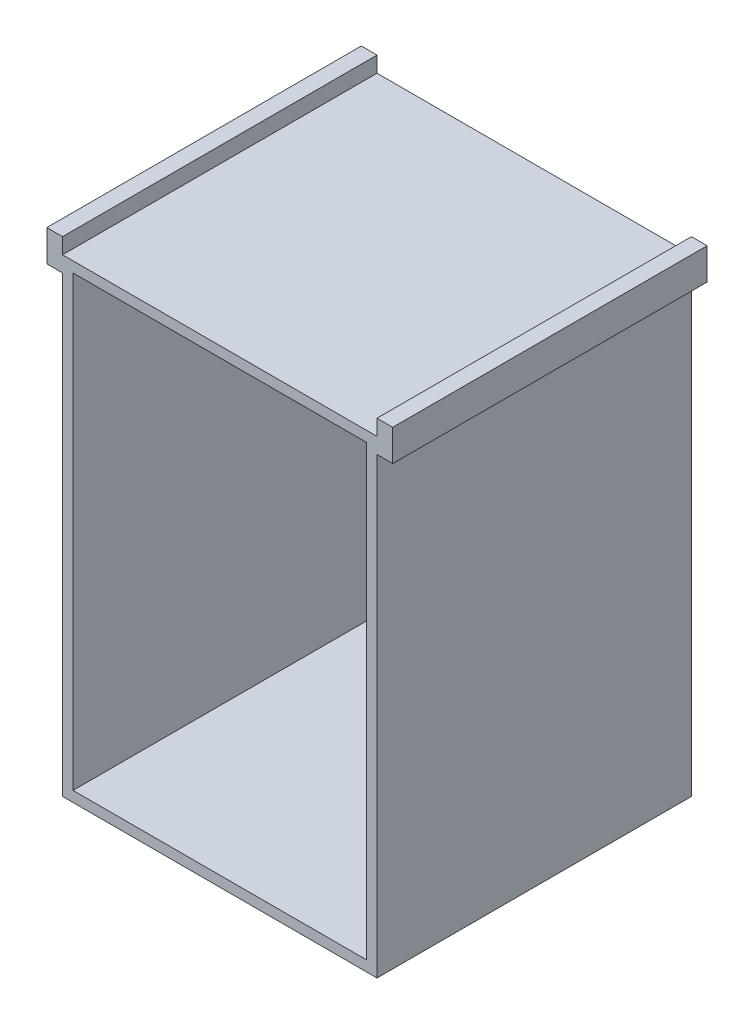
ISO-10303-21;
HEADER;
FILE_DESCRIPTION(('STEP AP214'),'2;1');
FILE_NAME('part.step','',(''),(''),'','','');
FILE_SCHEMA(('AUTOMOTIVE_DESIGN { 1 0 10303 214 1 1 1 1 }'));
ENDSEC;
DATA;
#1=APPLICATION_CONTEXT('core data for automotive mechanical design processes');
#2=APPLICATION_PROTOCOL_DEFINITION('international standard','automotive_design',2000,#1);
#3=PRODUCT_CONTEXT('',#1,'mechanical');
#4=PRODUCT('Part','Part','',(#3));
#5=PRODUCT_RELATED_PRODUCT_CATEGORY('part','',(#4));
#6=PRODUCT_DEFINITION_FORMATION('','',#4);
#7=PRODUCT_DEFINITION_CONTEXT('part definition',#1,'design');
#8=PRODUCT_DEFINITION('design','',#6,#7);
#9=PRODUCT_DEFINITION_SHAPE('','',#8);
#10=(LENGTH_UNIT() NAMED_UNIT(*) SI_UNIT(.MILLI.,.METRE.));
#11=(NAMED_UNIT(*) PLANE_ANGLE_UNIT() SI_UNIT($,.RADIAN.));
#12=(NAMED_UNIT(*) SI_UNIT($,.STERADIAN.) SOLID_ANGLE_UNIT());
#13=UNCERTAINTY_MEASURE_WITH_UNIT(LENGTH_MEASURE(1.E-05),#10,'distance_accuracy_value','');
#14=(GEOMETRIC_REPRESENTATION_CONTEXT(3) GLOBAL_UNCERTAINTY_ASSIGNED_CONTEXT((#13)) GLOBAL_UNIT_ASSIGNED_CONTEXT((#10,
#11,#12)) REPRESENTATION_CONTEXT('',''));
#15=CARTESIAN_POINT('',(0.,0.,0.));
#16=DIRECTION('',(0.,0.,1.));
#17=DIRECTION('',(1.,0.,0.));
#18=AXIS2_PLACEMENT_3D('',#15,#16,#17);
#19=CARTESIAN_POINT('',(-100.647761504265,89.5,5.40836964344638));
#20=DIRECTION('',(1.,0.,0.));
#21=DIRECTION('',(0.,0.,-1.));
#22=AXIS2_PLACEMENT_3D('',#19,#20,#21);
#23=PLANE('',#22);
#24=DIRECTION('',(0.,-1.,0.));
#25=VECTOR('',#24,1.);
#26=CARTESIAN_POINT('',(-100.647761504265,89.5,5.40836964344638));
#27=LINE('',#26,#25);
#28=CARTESIAN_POINT('',(-100.647761504265,86.5,5.40836964344638));
#29=VERTEX_POINT('',#28);
#30=CARTESIAN_POINT('',(-100.647761504265,0.,5.40836964344638));
#31=VERTEX_POINT('',#30);
#32=EDGE_CURVE('E11',#29,#31,#27,.T.);
#33=ORIENTED_EDGE('',*,*,#32,.F.);
#34=DIRECTION('',(0.,0.,-1.));
#35=VECTOR('',#34,1.);
#36=CARTESIAN_POINT('',(-100.647761504265,86.5,5.40836964344638));
#37=LINE('',#36,#35);
#38=CARTESIAN_POINT('',(-100.647761504265,86.5,-54.5916303565536));
#39=VERTEX_POINT('',#38);
#40=EDGE_CURVE('E224',#29,#39,#37,.T.);
#41=ORIENTED_EDGE('',*,*,#40,.T.);
#42=DIRECTION('',(0.,-1.,0.));
#43=VECTOR('',#42,1.);
#44=CARTESIAN_POINT('',(-100.647761504265,89.5,-54.5916303565536));
#45=LINE('',#44,#43);
#46=CARTESIAN_POINT('',(-100.647761504265,0.,-54.5916303565536));
#47=VERTEX_POINT('',#46);
#48=EDGE_CURVE('E308',#39,#47,#45,.T.);
#49=ORIENTED_EDGE('',*,*,#48,.T.);
#50=DIRECTION('',(0.,0.,1.));
#51=VECTOR('',#50,1.);
#52=CARTESIAN_POINT('',(-100.647761504265,0.,5.40836964344638));
#53=LINE('',#52,#51);
#54=EDGE_CURVE('E284',#47,#31,#53,.T.);
#55=ORIENTED_EDGE('',*,*,#54,.T.);
#56=EDGE_LOOP('',(#33,#41,#49,#55));
#57=FACE_BOUND('',#56,.T.);
#58=ADVANCED_FACE('F39',(#57),#23,.F.);
#59=CARTESIAN_POINT('',(-40.647761504265,89.5,5.40836964344638));
#60=DIRECTION('',(0.,0.,-1.));
#61=DIRECTION('',(-1.,0.,0.));
#62=AXIS2_PLACEMENT_3D('',#59,#60,#61);
#63=PLANE('',#62);
#64=DIRECTION('',(1.,0.,0.));
#65=VECTOR('',#64,1.);
#66=CARTESIAN_POINT('',(-42.6477615042649,1.99999999999999,5.40836964344638));
#67=LINE('',#66,#65);
#68=CARTESIAN_POINT('',(-98.647761504265,1.99999999999999,5.40836964344638));
#69=VERTEX_POINT('',#68);
#70=CARTESIAN_POINT('',(-42.6477615042649,1.99999999999999,5.40836964344638));
#71=VERTEX_POINT('',#70);
#72=EDGE_CURVE('E270',#69,#71,#67,.T.);
#73=ORIENTED_EDGE('',*,*,#72,.F.);
#74=DIRECTION('',(0.,-1.,0.));
#75=VECTOR('',#74,1.);
#76=CARTESIAN_POINT('',(-98.647761504265,1.99999999999999,5.40836964344638));
#77=LINE('',#76,#75);
#78=CARTESIAN_POINT('',(-98.647761504265,87.5,5.40836964344638));
#79=VERTEX_POINT('',#78);
#80=EDGE_CURVE('E241',#79,#69,#77,.T.);
#81=ORIENTED_EDGE('',*,*,#80,.F.);
#82=DIRECTION('',(-1.,0.,0.));
#83=VECTOR('',#82,1.);
#84=CARTESIAN_POINT('',(-98.647761504265,87.5,5.40836964344638));
#85=LINE('',#84,#83);
#86=CARTESIAN_POINT('',(-42.647761504265,87.5,5.40836964344638));
#87=VERTEX_POINT('',#86);
#88=EDGE_CURVE('E255',#87,#79,#85,.T.);
#89=ORIENTED_EDGE('',*,*,#88,.F.);
#90=DIRECTION('',(0.,1.,0.));
#91=VECTOR('',#90,1.);
#92=CARTESIAN_POINT('',(-42.647761504265,87.5,5.40836964344638));
#93=LINE('',#92,#91);
#94=EDGE_CURVE('E274',#71,#87,#93,.T.);
#95=ORIENTED_EDGE('',*,*,#94,.F.);
#96=EDGE_LOOP('',(#73,#81,#89,#95));
#97=FACE_BOUND('',#96,.T.);
#98=DIRECTION('',(1.,0.,0.));
#99=VECTOR('',#98,1.);
#100=CARTESIAN_POINT('',(-40.647761504265,0.,5.40836964344638));
#101=LINE('',#100,#99);
#102=CARTESIAN_POINT('',(-40.647761504265,0.,5.40836964344638));
#103=VERTEX_POINT('',#102);
#104=EDGE_CURVE('E312',#31,#103,#101,.T.);
#105=ORIENTED_EDGE('',*,*,#104,.T.);
#106=DIRECTION('',(0.,-1.,0.));
#107=VECTOR('',#106,1.);
#108=CARTESIAN_POINT('',(-40.647761504265,89.5,5.40836964344638));
#109=LINE('',#108,#107);
#110=CARTESIAN_POINT('',(-40.647761504265,86.5,5.40836964344638));
#111=VERTEX_POINT('',#110);
#112=EDGE_CURVE('E47',#111,#103,#109,.T.);
#113=ORIENTED_EDGE('',*,*,#112,.F.);
#114=DIRECTION('',(1.,0.,0.));
#115=VECTOR('',#114,1.);
#116=CARTESIAN_POINT('',(-37.647761504265,86.5,5.40836964344638));
#117=LINE('',#116,#115);
#118=CARTESIAN_POINT('',(-37.647761504265,86.5,5.40836964344638));
#119=VERTEX_POINT('',#118);
#120=EDGE_CURVE('E54',#111,#119,#117,.T.);
#121=ORIENTED_EDGE('',*,*,#120,.T.);
#122=DIRECTION('',(0.,1.,0.));
#123=VECTOR('',#122,1.);
#124=CARTESIAN_POINT('',(-37.647761504265,86.5,5.40836964344638));
#125=LINE('',#124,#123);
#126=CARTESIAN_POINT('',(-37.647761504265,92.5,5.40836964344638));
#127=VERTEX_POINT('',#126);
#128=EDGE_CURVE('E164',#119,#127,#125,.T.);
#129=ORIENTED_EDGE('',*,*,#128,.T.);
#130=DIRECTION('',(1.,0.,0.));
#131=VECTOR('',#130,1.);
#132=CARTESIAN_POINT('',(-37.647761504265,92.5,5.40836964344638));
#133=LINE('',#132,#131);
#134=CARTESIAN_POINT('',(-40.647761504265,92.5,5.40836964344638));
#135=VERTEX_POINT('',#134);
#136=EDGE_CURVE('E168',#135,#127,#133,.T.);
#137=ORIENTED_EDGE('',*,*,#136,.F.);
#138=DIRECTION('',(0.,1.,0.));
#139=VECTOR('',#138,1.);
#140=CARTESIAN_POINT('',(-40.647761504265,86.5,5.40836964344638));
#141=LINE('',#140,#139);
#142=CARTESIAN_POINT('',(-40.647761504265,89.5,5.40836964344638));
#143=VERTEX_POINT('',#142);
#144=EDGE_CURVE('E153',#143,#135,#141,.T.);
#145=ORIENTED_EDGE('',*,*,#144,.F.);
#146=DIRECTION('',(1.,0.,0.));
#147=VECTOR('',#146,1.);
#148=CARTESIAN_POINT('',(-40.647761504265,89.5,5.40836964344638));
#149=LINE('',#148,#147);
#150=CARTESIAN_POINT('',(-100.647761504265,89.5,5.40836964344638));
#151=VERTEX_POINT('',#150);
#152=EDGE_CURVE('E298',#151,#143,#149,.T.);
#153=ORIENTED_EDGE('',*,*,#152,.F.);
#154=DIRECTION('',(0.,1.,0.));
#155=VECTOR('',#154,1.);
#156=CARTESIAN_POINT('',(-100.647761504265,86.5,5.40836964344638));
#157=LINE('',#156,#155);
#158=CARTESIAN_POINT('',(-100.647761504265,92.5,5.40836964344638));
#159=VERTEX_POINT('',#158);
#160=EDGE_CURVE('E238',#151,#159,#157,.T.);
#161=ORIENTED_EDGE('',*,*,#160,.T.);
#162=DIRECTION('',(1.,0.,0.));
#163=VECTOR('',#162,1.);
#164=CARTESIAN_POINT('',(-103.647761504265,92.5,5.40836964344638));
#165=LINE('',#164,#163);
#166=CARTESIAN_POINT('',(-103.647761504265,92.5,5.40836964344638));
#167=VERTEX_POINT('',#166);
#168=EDGE_CURVE('E220',#167,#159,#165,.T.);
#169=ORIENTED_EDGE('',*,*,#168,.F.);
#170=DIRECTION('',(0.,1.,0.));
#171=VECTOR('',#170,1.);
#172=CARTESIAN_POINT('',(-103.647761504265,86.5,5.40836964344638));
#173=LINE('',#172,#171);
#174=CARTESIAN_POINT('',(-103.647761504265,86.5,5.40836964344638));
#175=VERTEX_POINT('',#174);
#176=EDGE_CURVE('E242',#175,#167,#173,.T.);
#177=ORIENTED_EDGE('',*,*,#176,.F.);
#178=DIRECTION('',(1.,0.,0.));
#179=VECTOR('',#178,1.);
#180=CARTESIAN_POINT('',(-103.647761504265,86.5,5.40836964344638));
#181=LINE('',#180,#179);
#182=EDGE_CURVE('E233',#175,#29,#181,.T.);
#183=ORIENTED_EDGE('',*,*,#182,.T.);
#184=ORIENTED_EDGE('',*,*,#32,.T.);
#185=EDGE_LOOP('',(#105,#113,#121,#129,#137,#145,#153,#161,#169,#177,#183,#184));
#186=FACE_BOUND('',#185,.T.);
#187=ADVANCED_FACE('F170',(#97,#186),#63,.F.);
#188=CARTESIAN_POINT('',(-40.647761504265,89.5,-54.5916303565536));
#189=DIRECTION('',(-1.,0.,0.));
#190=DIRECTION('',(0.,0.,1.));
#191=AXIS2_PLACEMENT_3D('',#188,#189,#190);
#192=PLANE('',#191);
#193=DIRECTION('',(0.,-1.,0.));
#194=VECTOR('',#193,1.);
#195=CARTESIAN_POINT('',(-40.647761504265,89.5,-54.5916303565536));
#196=LINE('',#195,#194);
#197=CARTESIAN_POINT('',(-40.647761504265,86.5,-54.5916303565536));
#198=VERTEX_POINT('',#197);
#199=CARTESIAN_POINT('',(-40.647761504265,0.,-54.5916303565536));
#200=VERTEX_POINT('',#199);
#201=EDGE_CURVE('E324',#198,#200,#196,.T.);
#202=ORIENTED_EDGE('',*,*,#201,.F.);
#203=DIRECTION('',(0.,0.,1.));
#204=VECTOR('',#203,1.);
#205=CARTESIAN_POINT('',(-40.647761504265,86.5,5.40836964344638));
#206=LINE('',#205,#204);
#207=EDGE_CURVE('E188',#198,#111,#206,.T.);
#208=ORIENTED_EDGE('',*,*,#207,.T.);
#209=ORIENTED_EDGE('',*,*,#112,.T.);
#210=DIRECTION('',(0.,0.,-1.));
#211=VECTOR('',#210,1.);
#212=CARTESIAN_POINT('',(-40.647761504265,0.,-54.5916303565536));
#213=LINE('',#212,#211);
#214=EDGE_CURVE('E315',#103,#200,#213,.T.);
#215=ORIENTED_EDGE('',*,*,#214,.T.);
#216=EDGE_LOOP('',(#202,#208,#209,#215));
#217=FACE_BOUND('',#216,.T.);
#218=ADVANCED_FACE('F330',(#217),#192,.F.);
#219=CARTESIAN_POINT('',(-100.647761504265,89.5,-54.5916303565536));
#220=DIRECTION('',(0.,0.,1.));
#221=DIRECTION('',(1.,0.,0.));
#222=AXIS2_PLACEMENT_3D('',#219,#220,#221);
#223=PLANE('',#222);
#224=DIRECTION('',(-1.,0.,0.));
#225=VECTOR('',#224,1.);
#226=CARTESIAN_POINT('',(-98.647761504265,87.5,-54.5916303565536));
#227=LINE('',#226,#225);
#228=CARTESIAN_POINT('',(-42.647761504265,87.5,-54.5916303565536));
#229=VERTEX_POINT('',#228);
#230=CARTESIAN_POINT('',(-98.647761504265,87.5,-54.5916303565536));
#231=VERTEX_POINT('',#230);
#232=EDGE_CURVE('E263',#229,#231,#227,.T.);
#233=ORIENTED_EDGE('',*,*,#232,.T.);
#234=DIRECTION('',(0.,-1.,0.));
#235=VECTOR('',#234,1.);
#236=CARTESIAN_POINT('',(-98.647761504265,1.99999999999999,-54.5916303565536));
#237=LINE('',#236,#235);
#238=CARTESIAN_POINT('',(-98.647761504265,1.99999999999999,-54.5916303565536));
#239=VERTEX_POINT('',#238);
#240=EDGE_CURVE('E250',#231,#239,#237,.T.);
#241=ORIENTED_EDGE('',*,*,#240,.T.);
#242=DIRECTION('',(1.,0.,0.));
#243=VECTOR('',#242,1.);
#244=CARTESIAN_POINT('',(-42.6477615042649,1.99999999999999,-54.5916303565536));
#245=LINE('',#244,#243);
#246=CARTESIAN_POINT('',(-42.6477615042649,1.99999999999999,-54.5916303565536));
#247=VERTEX_POINT('',#246);
#248=EDGE_CURVE('E254',#239,#247,#245,.T.);
#249=ORIENTED_EDGE('',*,*,#248,.T.);
#250=DIRECTION('',(0.,1.,0.));
#251=VECTOR('',#250,1.);
#252=CARTESIAN_POINT('',(-42.647761504265,87.5,-54.5916303565536));
#253=LINE('',#252,#251);
#254=EDGE_CURVE('E259',#247,#229,#253,.T.);
#255=ORIENTED_EDGE('',*,*,#254,.T.);
#256=EDGE_LOOP('',(#233,#241,#249,#255));
#257=FACE_BOUND('',#256,.T.);
#258=DIRECTION('',(-1.,0.,0.));
#259=VECTOR('',#258,1.);
#260=CARTESIAN_POINT('',(-100.647761504265,0.,-54.5916303565536));
#261=LINE('',#260,#259);
#262=EDGE_CURVE('E299',#200,#47,#261,.T.);
#263=ORIENTED_EDGE('',*,*,#262,.T.);
#264=ORIENTED_EDGE('',*,*,#48,.F.);
#265=DIRECTION('',(-1.,0.,0.));
#266=VECTOR('',#265,1.);
#267=CARTESIAN_POINT('',(-100.647761504265,86.5,-54.5916303565536));
#268=LINE('',#267,#266);
#269=CARTESIAN_POINT('',(-103.647761504265,86.5,-54.5916303565536));
#270=VERTEX_POINT('',#269);
#271=EDGE_CURVE('E62',#39,#270,#268,.T.);
#272=ORIENTED_EDGE('',*,*,#271,.T.);
#273=DIRECTION('',(0.,1.,0.));
#274=VECTOR('',#273,1.);
#275=CARTESIAN_POINT('',(-103.647761504265,86.5,-54.5916303565536));
#276=LINE('',#275,#274);
#277=CARTESIAN_POINT('',(-103.647761504265,92.5,-54.5916303565536));
#278=VERTEX_POINT('',#277);
#279=EDGE_CURVE('E245',#270,#278,#276,.T.);
#280=ORIENTED_EDGE('',*,*,#279,.T.);
#281=DIRECTION('',(-1.,0.,0.));
#282=VECTOR('',#281,1.);
#283=CARTESIAN_POINT('',(-100.647761504265,92.5,-54.5916303565536));
#284=LINE('',#283,#282);
#285=CARTESIAN_POINT('',(-100.647761504265,92.5,-54.5916303565536));
#286=VERTEX_POINT('',#285);
#287=EDGE_CURVE('E212',#286,#278,#284,.T.);
#288=ORIENTED_EDGE('',*,*,#287,.F.);
#289=DIRECTION('',(0.,1.,0.));
#290=VECTOR('',#289,1.);
#291=CARTESIAN_POINT('',(-100.647761504265,86.5,-54.5916303565536));
#292=LINE('',#291,#290);
#293=CARTESIAN_POINT('',(-100.647761504265,89.5,-54.5916303565536));
#294=VERTEX_POINT('',#293);
#295=EDGE_CURVE('E237',#294,#286,#292,.T.);
#296=ORIENTED_EDGE('',*,*,#295,.F.);
#297=DIRECTION('',(-1.,0.,0.));
#298=VECTOR('',#297,1.);
#299=CARTESIAN_POINT('',(-100.647761504265,89.5,-54.5916303565536));
#300=LINE('',#299,#298);
#301=CARTESIAN_POINT('',(-40.647761504265,89.5,-54.5916303565536));
#302=VERTEX_POINT('',#301);
#303=EDGE_CURVE('E304',#302,#294,#300,.T.);
#304=ORIENTED_EDGE('',*,*,#303,.F.);
#305=DIRECTION('',(0.,1.,0.));
#306=VECTOR('',#305,1.);
#307=CARTESIAN_POINT('',(-40.647761504265,86.5,-54.5916303565536));
#308=LINE('',#307,#306);
#309=CARTESIAN_POINT('',(-40.647761504265,92.5,-54.5916303565536));
#310=VERTEX_POINT('',#309);
#311=EDGE_CURVE('E200',#302,#310,#308,.T.);
#312=ORIENTED_EDGE('',*,*,#311,.T.);
#313=DIRECTION('',(-1.,0.,0.));
#314=VECTOR('',#313,1.);
#315=CARTESIAN_POINT('',(-40.647761504265,92.5,-54.5916303565536));
#316=LINE('',#315,#314);
#317=CARTESIAN_POINT('',(-37.647761504265,92.5,-54.5916303565536));
#318=VERTEX_POINT('',#317);
#319=EDGE_CURVE('E180',#318,#310,#316,.T.);
#320=ORIENTED_EDGE('',*,*,#319,.F.);
#321=DIRECTION('',(0.,1.,0.));
#322=VECTOR('',#321,1.);
#323=CARTESIAN_POINT('',(-37.647761504265,86.5,-54.5916303565536));
#324=LINE('',#323,#322);
#325=CARTESIAN_POINT('',(-37.647761504265,86.5,-54.5916303565536));
#326=VERTEX_POINT('',#325);
#327=EDGE_CURVE('E204',#326,#318,#324,.T.);
#328=ORIENTED_EDGE('',*,*,#327,.F.);
#329=DIRECTION('',(-1.,0.,0.));
#330=VECTOR('',#329,1.);
#331=CARTESIAN_POINT('',(-40.647761504265,86.5,-54.5916303565536));
#332=LINE('',#331,#330);
#333=EDGE_CURVE('E165',#326,#198,#332,.T.);
#334=ORIENTED_EDGE('',*,*,#333,.T.);
#335=ORIENTED_EDGE('',*,*,#201,.T.);
#336=EDGE_LOOP('',(#263,#264,#272,#280,#288,#296,#304,#312,#320,#328,#334,#335));
#337=FACE_BOUND('',#336,.T.);
#338=ADVANCED_FACE('F340',(#257,#337),#223,.F.);
#339=CARTESIAN_POINT('',(0.,89.5,0.));
#340=DIRECTION('',(0.,-1.,0.));
#341=DIRECTION('',(0.,0.,-1.));
#342=AXIS2_PLACEMENT_3D('',#339,#340,#341);
#343=PLANE('',#342);
#344=DIRECTION('',(0.,0.,1.));
#345=VECTOR('',#344,1.);
#346=CARTESIAN_POINT('',(-100.647761504265,89.5,5.40836964344638));
#347=LINE('',#346,#345);
#348=EDGE_CURVE('E294',#294,#151,#347,.T.);
#349=ORIENTED_EDGE('',*,*,#348,.T.);
#350=ORIENTED_EDGE('',*,*,#152,.T.);
#351=DIRECTION('',(0.,0.,-1.));
#352=VECTOR('',#351,1.);
#353=CARTESIAN_POINT('',(-40.647761504265,89.5,-54.5916303565536));
#354=LINE('',#353,#352);
#355=EDGE_CURVE('E159',#143,#302,#354,.T.);
#356=ORIENTED_EDGE('',*,*,#355,.T.);
#357=ORIENTED_EDGE('',*,*,#303,.T.);
#358=EDGE_LOOP('',(#349,#350,#356,#357));
#359=FACE_BOUND('',#358,.T.);
#360=ADVANCED_FACE('F348',(#359),#343,.F.);
#361=CARTESIAN_POINT('',(0.,0.,0.));
#362=DIRECTION('',(0.,-1.,0.));
#363=DIRECTION('',(0.,0.,-1.));
#364=AXIS2_PLACEMENT_3D('',#361,#362,#363);
#365=PLANE('',#364);
#366=ORIENTED_EDGE('',*,*,#54,.F.);
#367=ORIENTED_EDGE('',*,*,#262,.F.);
#368=ORIENTED_EDGE('',*,*,#214,.F.);
#369=ORIENTED_EDGE('',*,*,#104,.F.);
#370=EDGE_LOOP('',(#366,#367,#368,#369));
#371=FACE_BOUND('',#370,.T.);
#372=ADVANCED_FACE('F337',(#371),#365,.T.);
#373=CARTESIAN_POINT('',(-98.647761504265,1.99999999999999,-54.5916303565536));
#374=DIRECTION('',(-1.,0.,0.));
#375=DIRECTION('',(0.,0.,1.));
#376=AXIS2_PLACEMENT_3D('',#373,#374,#375);
#377=PLANE('',#376);
#378=ORIENTED_EDGE('',*,*,#80,.T.);
#379=DIRECTION('',(0.,0.,1.));
#380=VECTOR('',#379,1.);
#381=CARTESIAN_POINT('',(-98.647761504265,1.99999999999999,-54.5916303565536));
#382=LINE('',#381,#380);
#383=EDGE_CURVE('E267',#239,#69,#382,.T.);
#384=ORIENTED_EDGE('',*,*,#383,.F.);
#385=ORIENTED_EDGE('',*,*,#240,.F.);
#386=DIRECTION('',(0.,0.,1.));
#387=VECTOR('',#386,1.);
#388=CARTESIAN_POINT('',(-98.647761504265,87.5,-54.5916303565536));
#389=LINE('',#388,#387);
#390=EDGE_CURVE('E281',#231,#79,#389,.T.);
#391=ORIENTED_EDGE('',*,*,#390,.T.);
#392=EDGE_LOOP('',(#378,#384,#385,#391));
#393=FACE_BOUND('',#392,.T.);
#394=ADVANCED_FACE('F386',(#393),#377,.F.);
#395=CARTESIAN_POINT('',(-98.647761504265,87.5,-54.5916303565536));
#396=DIRECTION('',(0.,1.,0.));
#397=DIRECTION('',(0.,0.,1.));
#398=AXIS2_PLACEMENT_3D('',#395,#396,#397);
#399=PLANE('',#398);
#400=ORIENTED_EDGE('',*,*,#88,.T.);
#401=ORIENTED_EDGE('',*,*,#390,.F.);
#402=ORIENTED_EDGE('',*,*,#232,.F.);
#403=DIRECTION('',(0.,0.,1.));
#404=VECTOR('',#403,1.);
#405=CARTESIAN_POINT('',(-42.647761504265,87.5,-54.5916303565536));
#406=LINE('',#405,#404);
#407=EDGE_CURVE('E285',#229,#87,#406,.T.);
#408=ORIENTED_EDGE('',*,*,#407,.T.);
#409=EDGE_LOOP('',(#400,#401,#402,#408));
#410=FACE_BOUND('',#409,.T.);
#411=ADVANCED_FACE('F391',(#410),#399,.F.);
#412=CARTESIAN_POINT('',(-42.647761504265,87.5,-54.5916303565536));
#413=DIRECTION('',(1.,0.,0.));
#414=DIRECTION('',(0.,1.,0.));
#415=AXIS2_PLACEMENT_3D('',#412,#413,#414);
#416=PLANE('',#415);
#417=ORIENTED_EDGE('',*,*,#94,.T.);
#418=ORIENTED_EDGE('',*,*,#407,.F.);
#419=ORIENTED_EDGE('',*,*,#254,.F.);
#420=DIRECTION('',(0.,0.,1.));
#421=VECTOR('',#420,1.);
#422=CARTESIAN_POINT('',(-42.6477615042649,1.99999999999999,-54.5916303565536));
#423=LINE('',#422,#421);
#424=EDGE_CURVE('E288',#247,#71,#423,.T.);
#425=ORIENTED_EDGE('',*,*,#424,.T.);
#426=EDGE_LOOP('',(#417,#418,#419,#425));
#427=FACE_BOUND('',#426,.T.);
#428=ADVANCED_FACE('F396',(#427),#416,.F.);
#429=CARTESIAN_POINT('',(-42.6477615042649,1.99999999999999,-54.5916303565536));
#430=DIRECTION('',(0.,-1.,0.));
#431=DIRECTION('',(0.,0.,-1.));
#432=AXIS2_PLACEMENT_3D('',#429,#430,#431);
#433=PLANE('',#432);
#434=ORIENTED_EDGE('',*,*,#72,.T.);
#435=ORIENTED_EDGE('',*,*,#424,.F.);
#436=ORIENTED_EDGE('',*,*,#248,.F.);
#437=ORIENTED_EDGE('',*,*,#383,.T.);
#438=EDGE_LOOP('',(#434,#435,#436,#437));
#439=FACE_BOUND('',#438,.T.);
#440=ADVANCED_FACE('F393',(#439),#433,.F.);
#441=CARTESIAN_POINT('',(-100.647761504265,86.5,5.40836964344638));
#442=DIRECTION('',(1.,0.,0.));
#443=DIRECTION('',(0.,0.,-1.));
#444=AXIS2_PLACEMENT_3D('',#441,#442,#443);
#445=PLANE('',#444);
#446=ORIENTED_EDGE('',*,*,#348,.F.);
#447=ORIENTED_EDGE('',*,*,#295,.T.);
#448=DIRECTION('',(0.,0.,-1.));
#449=VECTOR('',#448,1.);
#450=CARTESIAN_POINT('',(-100.647761504265,92.5,5.40836964344638));
#451=LINE('',#450,#449);
#452=EDGE_CURVE('E203',#159,#286,#451,.T.);
#453=ORIENTED_EDGE('',*,*,#452,.F.);
#454=ORIENTED_EDGE('',*,*,#160,.F.);
#455=EDGE_LOOP('',(#446,#447,#453,#454));
#456=FACE_BOUND('',#455,.T.);
#457=ADVANCED_FACE('F355',(#456),#445,.T.);
#458=CARTESIAN_POINT('',(-103.647761504265,86.5,-54.5916303565536));
#459=DIRECTION('',(-1.,0.,0.));
#460=DIRECTION('',(0.,0.,1.));
#461=AXIS2_PLACEMENT_3D('',#458,#459,#460);
#462=PLANE('',#461);
#463=ORIENTED_EDGE('',*,*,#176,.T.);
#464=DIRECTION('',(0.,0.,1.));
#465=VECTOR('',#464,1.);
#466=CARTESIAN_POINT('',(-103.647761504265,92.5,-54.5916303565536));
#467=LINE('',#466,#465);
#468=EDGE_CURVE('E216',#278,#167,#467,.T.);
#469=ORIENTED_EDGE('',*,*,#468,.F.);
#470=ORIENTED_EDGE('',*,*,#279,.F.);
#471=DIRECTION('',(0.,0.,1.));
#472=VECTOR('',#471,1.);
#473=CARTESIAN_POINT('',(-103.647761504265,86.5,-54.5916303565536));
#474=LINE('',#473,#472);
#475=EDGE_CURVE('E229',#270,#175,#474,.T.);
#476=ORIENTED_EDGE('',*,*,#475,.T.);
#477=EDGE_LOOP('',(#463,#469,#470,#476));
#478=FACE_BOUND('',#477,.T.);
#479=ADVANCED_FACE('F358',(#478),#462,.T.);
#480=CARTESIAN_POINT('',(0.,86.5,0.));
#481=DIRECTION('',(0.,1.,0.));
#482=DIRECTION('',(0.,0.,1.));
#483=AXIS2_PLACEMENT_3D('',#480,#481,#482);
#484=PLANE('',#483);
#485=ORIENTED_EDGE('',*,*,#40,.F.);
#486=ORIENTED_EDGE('',*,*,#182,.F.);
#487=ORIENTED_EDGE('',*,*,#475,.F.);
#488=ORIENTED_EDGE('',*,*,#271,.F.);
#489=EDGE_LOOP('',(#485,#486,#487,#488));
#490=FACE_BOUND('',#489,.T.);
#491=ADVANCED_FACE('F361',(#490),#484,.F.);
#492=CARTESIAN_POINT('',(0.,92.5,0.));
#493=DIRECTION('',(0.,1.,0.));
#494=DIRECTION('',(0.,0.,1.));
#495=AXIS2_PLACEMENT_3D('',#492,#493,#494);
#496=PLANE('',#495);
#497=ORIENTED_EDGE('',*,*,#452,.T.);
#498=ORIENTED_EDGE('',*,*,#287,.T.);
#499=ORIENTED_EDGE('',*,*,#468,.T.);
#500=ORIENTED_EDGE('',*,*,#168,.T.);
#501=EDGE_LOOP('',(#497,#498,#499,#500));
#502=FACE_BOUND('',#501,.T.);
#503=ADVANCED_FACE('F353',(#502),#496,.T.);
#504=CARTESIAN_POINT('',(-40.647761504265,86.5,5.40836964344638));
#505=DIRECTION('',(-1.,0.,0.));
#506=DIRECTION('',(0.,0.,1.));
#507=AXIS2_PLACEMENT_3D('',#504,#505,#506);
#508=PLANE('',#507);
#509=ORIENTED_EDGE('',*,*,#355,.F.);
#510=ORIENTED_EDGE('',*,*,#144,.T.);
#511=DIRECTION('',(0.,0.,1.));
#512=VECTOR('',#511,1.);
#513=CARTESIAN_POINT('',(-40.647761504265,92.5,5.40836964344638));
#514=LINE('',#513,#512);
#515=EDGE_CURVE('E157',#310,#135,#514,.T.);
#516=ORIENTED_EDGE('',*,*,#515,.F.);
#517=ORIENTED_EDGE('',*,*,#311,.F.);
#518=EDGE_LOOP('',(#509,#510,#516,#517));
#519=FACE_BOUND('',#518,.T.);
#520=ADVANCED_FACE('F155',(#519),#508,.T.);
#521=CARTESIAN_POINT('',(-37.647761504265,86.5,-54.5916303565536));
#522=DIRECTION('',(1.,0.,0.));
#523=DIRECTION('',(0.,0.,-1.));
#524=AXIS2_PLACEMENT_3D('',#521,#522,#523);
#525=PLANE('',#524);
#526=ORIENTED_EDGE('',*,*,#327,.T.);
#527=DIRECTION('',(0.,0.,-1.));
#528=VECTOR('',#527,1.);
#529=CARTESIAN_POINT('',(-37.647761504265,92.5,-54.5916303565536));
#530=LINE('',#529,#528);
#531=EDGE_CURVE('E175',#127,#318,#530,.T.);
#532=ORIENTED_EDGE('',*,*,#531,.F.);
#533=ORIENTED_EDGE('',*,*,#128,.F.);
#534=DIRECTION('',(0.,0.,-1.));
#535=VECTOR('',#534,1.);
#536=CARTESIAN_POINT('',(-37.647761504265,86.5,-54.5916303565536));
#537=LINE('',#536,#535);
#538=EDGE_CURVE('E193',#119,#326,#537,.T.);
#539=ORIENTED_EDGE('',*,*,#538,.T.);
#540=EDGE_LOOP('',(#526,#532,#533,#539));
#541=FACE_BOUND('',#540,.T.);
#542=ADVANCED_FACE('F344',(#541),#525,.T.);
#543=CARTESIAN_POINT('',(0.,86.5,0.));
#544=DIRECTION('',(0.,-1.,0.));
#545=DIRECTION('',(0.,0.,-1.));
#546=AXIS2_PLACEMENT_3D('',#543,#544,#545);
#547=PLANE('',#546);
#548=ORIENTED_EDGE('',*,*,#207,.F.);
#549=ORIENTED_EDGE('',*,*,#333,.F.);
#550=ORIENTED_EDGE('',*,*,#538,.F.);
#551=ORIENTED_EDGE('',*,*,#120,.F.);
#552=EDGE_LOOP('',(#548,#549,#550,#551));
#553=FACE_BOUND('',#552,.T.);
#554=ADVANCED_FACE('F342',(#553),#547,.T.);
#555=CARTESIAN_POINT('',(0.,92.5,0.));
#556=DIRECTION('',(0.,-1.,0.));
#557=DIRECTION('',(0.,0.,-1.));
#558=AXIS2_PLACEMENT_3D('',#555,#556,#557);
#559=PLANE('',#558);
#560=ORIENTED_EDGE('',*,*,#515,.T.);
#561=ORIENTED_EDGE('',*,*,#136,.T.);
#562=ORIENTED_EDGE('',*,*,#531,.T.);
#563=ORIENTED_EDGE('',*,*,#319,.T.);
#564=EDGE_LOOP('',(#560,#561,#562,#563));
#565=FACE_BOUND('',#564,.T.);
#566=ADVANCED_FACE('F178',(#565),#559,.F.);
#567=CLOSED_SHELL('',(#58,#187,#218,#338,#360,#372,#394,#411,#428,#440,#457,#479,#491,#503,#520,
#542,#554,#566));
#568=MANIFOLD_SOLID_BREP('B2',#567);
#569=ADVANCED_BREP_SHAPE_REPRESENTATION('',(#18,#568),#14);
#570=SHAPE_DEFINITION_REPRESENTATION(#9,#569);
ENDSEC;
END-ISO-10303-21;
